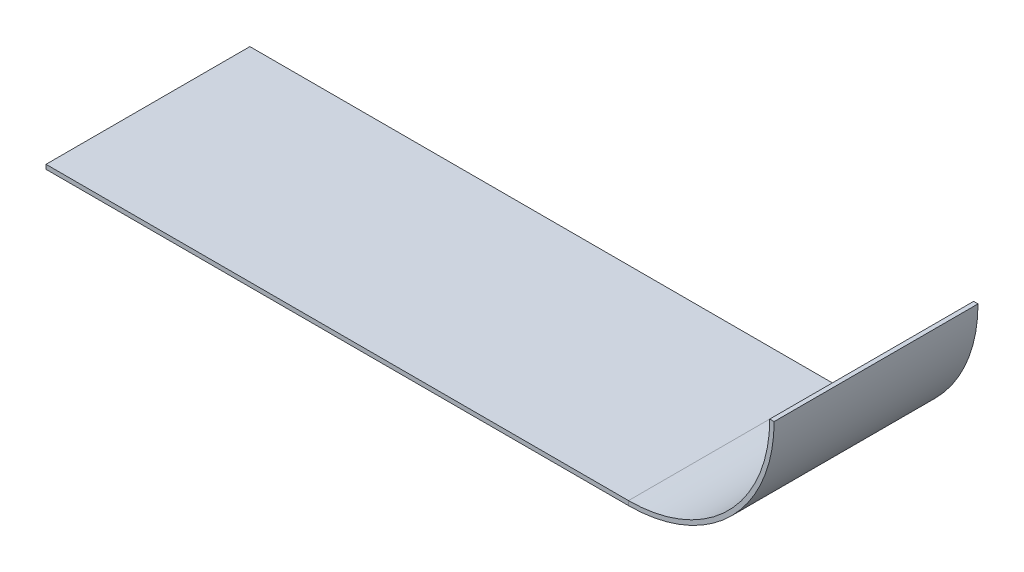
ISO-10303-21;
HEADER;
FILE_DESCRIPTION(('STEP AP214'),'2;1');
FILE_NAME('part.step','',(''),(''),'','','');
FILE_SCHEMA(('AUTOMOTIVE_DESIGN { 1 0 10303 214 1 1 1 1 }'));
ENDSEC;
DATA;
#1=APPLICATION_CONTEXT('core data for automotive mechanical design processes');
#2=APPLICATION_PROTOCOL_DEFINITION('international standard','automotive_design',2000,#1);
#3=PRODUCT_CONTEXT('',#1,'mechanical');
#4=PRODUCT('Part','Part','',(#3));
#5=PRODUCT_RELATED_PRODUCT_CATEGORY('part','',(#4));
#6=PRODUCT_DEFINITION_FORMATION('','',#4);
#7=PRODUCT_DEFINITION_CONTEXT('part definition',#1,'design');
#8=PRODUCT_DEFINITION('design','',#6,#7);
#9=PRODUCT_DEFINITION_SHAPE('','',#8);
#10=(LENGTH_UNIT() NAMED_UNIT(*) SI_UNIT(.MILLI.,.METRE.));
#11=(NAMED_UNIT(*) PLANE_ANGLE_UNIT() SI_UNIT($,.RADIAN.));
#12=(NAMED_UNIT(*) SI_UNIT($,.STERADIAN.) SOLID_ANGLE_UNIT());
#13=UNCERTAINTY_MEASURE_WITH_UNIT(LENGTH_MEASURE(1.E-05),#10,'distance_accuracy_value','');
#14=(GEOMETRIC_REPRESENTATION_CONTEXT(3) GLOBAL_UNCERTAINTY_ASSIGNED_CONTEXT((#13)) GLOBAL_UNIT_ASSIGNED_CONTEXT((#10,
#11,#12)) REPRESENTATION_CONTEXT('',''));
#15=CARTESIAN_POINT('',(0.,0.,0.));
#16=DIRECTION('',(0.,0.,1.));
#17=DIRECTION('',(1.,0.,0.));
#18=AXIS2_PLACEMENT_3D('',#15,#16,#17);
#19=CARTESIAN_POINT('',(200.,0.,70.));
#20=DIRECTION('',(0.,0.,1.));
#21=DIRECTION('',(1.,0.,0.));
#22=AXIS2_PLACEMENT_3D('',#19,#20,#21);
#23=PLANE('',#22);
#24=DIRECTION('',(0.,1.,0.));
#25=VECTOR('',#24,1.);
#26=CARTESIAN_POINT('',(200.,0.,70.));
#27=LINE('',#26,#25);
#28=CARTESIAN_POINT('',(200.,0.,70.));
#29=VERTEX_POINT('',#28);
#30=CARTESIAN_POINT('',(200.,1.50000000000002,70.));
#31=VERTEX_POINT('',#30);
#32=EDGE_CURVE('E11',#29,#31,#27,.T.);
#33=ORIENTED_EDGE('',*,*,#32,.F.);
#34=CARTESIAN_POINT('',(200.,50.,70.));
#35=DIRECTION('',(0.,0.,1.));
#36=DIRECTION('',(1.,0.,0.));
#37=AXIS2_PLACEMENT_3D('',#34,#35,#36);
#38=CIRCLE('',#37,50.);
#39=CARTESIAN_POINT('',(250.,50.,70.));
#40=VERTEX_POINT('',#39);
#41=EDGE_CURVE('E89',#29,#40,#38,.T.);
#42=ORIENTED_EDGE('',*,*,#41,.T.);
#43=DIRECTION('',(1.,0.,0.));
#44=VECTOR('',#43,1.);
#45=CARTESIAN_POINT('',(248.5,50.,70.));
#46=LINE('',#45,#44);
#47=CARTESIAN_POINT('',(248.5,50.,70.));
#48=VERTEX_POINT('',#47);
#49=EDGE_CURVE('E166',#48,#40,#46,.T.);
#50=ORIENTED_EDGE('',*,*,#49,.F.);
#51=CARTESIAN_POINT('',(200.,50.,70.));
#52=DIRECTION('',(0.,0.,1.));
#53=DIRECTION('',(1.,0.,0.));
#54=AXIS2_PLACEMENT_3D('',#51,#52,#53);
#55=CIRCLE('',#54,48.5);
#56=EDGE_CURVE('E118',#31,#48,#55,.T.);
#57=ORIENTED_EDGE('',*,*,#56,.F.);
#58=EDGE_LOOP('',(#33,#42,#50,#57));
#59=FACE_BOUND('',#58,.T.);
#60=ADVANCED_FACE('F41',(#59),#23,.T.);
#61=CARTESIAN_POINT('',(200.,1.50000000000002,0.));
#62=DIRECTION('',(0.,0.,-1.));
#63=DIRECTION('',(-1.,0.,0.));
#64=AXIS2_PLACEMENT_3D('',#61,#62,#63);
#65=PLANE('',#64);
#66=DIRECTION('',(0.,-1.,0.));
#67=VECTOR('',#66,1.);
#68=CARTESIAN_POINT('',(200.,1.50000000000002,0.));
#69=LINE('',#68,#67);
#70=CARTESIAN_POINT('',(200.,1.50000000000002,0.));
#71=VERTEX_POINT('',#70);
#72=CARTESIAN_POINT('',(200.,0.,0.));
#73=VERTEX_POINT('',#72);
#74=EDGE_CURVE('E50',#71,#73,#69,.T.);
#75=ORIENTED_EDGE('',*,*,#74,.F.);
#76=CARTESIAN_POINT('',(200.,50.,0.));
#77=DIRECTION('',(0.,0.,1.));
#78=DIRECTION('',(1.,0.,0.));
#79=AXIS2_PLACEMENT_3D('',#76,#77,#78);
#80=CIRCLE('',#79,48.5);
#81=CARTESIAN_POINT('',(248.5,50.,0.));
#82=VERTEX_POINT('',#81);
#83=EDGE_CURVE('E137',#71,#82,#80,.T.);
#84=ORIENTED_EDGE('',*,*,#83,.T.);
#85=DIRECTION('',(1.,0.,0.));
#86=VECTOR('',#85,1.);
#87=CARTESIAN_POINT('',(248.5,50.,0.));
#88=LINE('',#87,#86);
#89=CARTESIAN_POINT('',(250.,50.,0.));
#90=VERTEX_POINT('',#89);
#91=EDGE_CURVE('E133',#82,#90,#88,.T.);
#92=ORIENTED_EDGE('',*,*,#91,.T.);
#93=CARTESIAN_POINT('',(200.,50.,0.));
#94=DIRECTION('',(0.,0.,1.));
#95=DIRECTION('',(1.,0.,0.));
#96=AXIS2_PLACEMENT_3D('',#93,#94,#95);
#97=CIRCLE('',#96,50.);
#98=EDGE_CURVE('E129',#73,#90,#97,.T.);
#99=ORIENTED_EDGE('',*,*,#98,.F.);
#100=EDGE_LOOP('',(#75,#84,#92,#99));
#101=FACE_BOUND('',#100,.T.);
#102=ADVANCED_FACE('F172',(#101),#65,.T.);
#103=CARTESIAN_POINT('',(200.,50.,70.));
#104=DIRECTION('',(0.,0.,-1.));
#105=DIRECTION('',(-1.,0.,0.));
#106=AXIS2_PLACEMENT_3D('',#103,#104,#105);
#107=CYLINDRICAL_SURFACE('',#106,50.);
#108=ORIENTED_EDGE('',*,*,#98,.T.);
#109=DIRECTION('',(0.,0.,-1.));
#110=VECTOR('',#109,1.);
#111=CARTESIAN_POINT('',(250.,50.,70.));
#112=LINE('',#111,#110);
#113=EDGE_CURVE('E159',#40,#90,#112,.T.);
#114=ORIENTED_EDGE('',*,*,#113,.F.);
#115=ORIENTED_EDGE('',*,*,#41,.F.);
#116=DIRECTION('',(0.,0.,-1.));
#117=VECTOR('',#116,1.);
#118=CARTESIAN_POINT('',(200.,0.,70.));
#119=LINE('',#118,#117);
#120=EDGE_CURVE('E125',#29,#73,#119,.T.);
#121=ORIENTED_EDGE('',*,*,#120,.T.);
#122=EDGE_LOOP('',(#108,#114,#115,#121));
#123=FACE_BOUND('',#122,.T.);
#124=ADVANCED_FACE('F169',(#123),#107,.T.);
#125=CARTESIAN_POINT('',(248.5,50.,70.));
#126=DIRECTION('',(0.,1.,0.));
#127=DIRECTION('',(0.,0.,1.));
#128=AXIS2_PLACEMENT_3D('',#125,#126,#127);
#129=PLANE('',#128);
#130=ORIENTED_EDGE('',*,*,#91,.F.);
#131=DIRECTION('',(0.,0.,-1.));
#132=VECTOR('',#131,1.);
#133=CARTESIAN_POINT('',(248.5,50.,70.));
#134=LINE('',#133,#132);
#135=EDGE_CURVE('E156',#48,#82,#134,.T.);
#136=ORIENTED_EDGE('',*,*,#135,.F.);
#137=ORIENTED_EDGE('',*,*,#49,.T.);
#138=ORIENTED_EDGE('',*,*,#113,.T.);
#139=EDGE_LOOP('',(#130,#136,#137,#138));
#140=FACE_BOUND('',#139,.T.);
#141=ADVANCED_FACE('F165',(#140),#129,.T.);
#142=CARTESIAN_POINT('',(200.,50.,70.));
#143=DIRECTION('',(0.,0.,-1.));
#144=DIRECTION('',(-1.,0.,0.));
#145=AXIS2_PLACEMENT_3D('',#142,#143,#144);
#146=CYLINDRICAL_SURFACE('',#145,48.5);
#147=ORIENTED_EDGE('',*,*,#83,.F.);
#148=DIRECTION('',(0.,0.,-1.));
#149=VECTOR('',#148,1.);
#150=CARTESIAN_POINT('',(200.,1.50000000000002,70.));
#151=LINE('',#150,#149);
#152=EDGE_CURVE('E110',#31,#71,#151,.T.);
#153=ORIENTED_EDGE('',*,*,#152,.F.);
#154=ORIENTED_EDGE('',*,*,#56,.T.);
#155=ORIENTED_EDGE('',*,*,#135,.T.);
#156=EDGE_LOOP('',(#147,#153,#154,#155));
#157=FACE_BOUND('',#156,.T.);
#158=ADVANCED_FACE('F175',(#157),#146,.F.);
#159=CARTESIAN_POINT('',(0.,1.5,70.));
#160=DIRECTION('',(0.,1.,0.));
#161=DIRECTION('',(0.,0.,1.));
#162=AXIS2_PLACEMENT_3D('',#159,#160,#161);
#163=PLANE('',#162);
#164=DIRECTION('',(1.,0.,0.));
#165=VECTOR('',#164,1.);
#166=CARTESIAN_POINT('',(0.,1.5,0.));
#167=LINE('',#166,#165);
#168=CARTESIAN_POINT('',(0.,1.5,0.));
#169=VERTEX_POINT('',#168);
#170=EDGE_CURVE('E104',#169,#71,#167,.T.);
#171=ORIENTED_EDGE('',*,*,#170,.F.);
#172=DIRECTION('',(0.,0.,-1.));
#173=VECTOR('',#172,1.);
#174=CARTESIAN_POINT('',(0.,1.5,70.));
#175=LINE('',#174,#173);
#176=CARTESIAN_POINT('',(0.,1.5,70.));
#177=VERTEX_POINT('',#176);
#178=EDGE_CURVE('E99',#177,#169,#175,.T.);
#179=ORIENTED_EDGE('',*,*,#178,.F.);
#180=DIRECTION('',(1.,0.,0.));
#181=VECTOR('',#180,1.);
#182=CARTESIAN_POINT('',(0.,1.5,70.));
#183=LINE('',#182,#181);
#184=EDGE_CURVE('E103',#177,#31,#183,.T.);
#185=ORIENTED_EDGE('',*,*,#184,.T.);
#186=ORIENTED_EDGE('',*,*,#152,.T.);
#187=EDGE_LOOP('',(#171,#179,#185,#186));
#188=FACE_BOUND('',#187,.T.);
#189=ADVANCED_FACE('F101',(#188),#163,.T.);
#190=CARTESIAN_POINT('',(0.,0.,70.));
#191=DIRECTION('',(-1.,0.,0.));
#192=DIRECTION('',(0.,0.,1.));
#193=AXIS2_PLACEMENT_3D('',#190,#191,#192);
#194=PLANE('',#193);
#195=DIRECTION('',(0.,1.,0.));
#196=VECTOR('',#195,1.);
#197=CARTESIAN_POINT('',(0.,0.,0.));
#198=LINE('',#197,#196);
#199=CARTESIAN_POINT('',(0.,0.,0.));
#200=VERTEX_POINT('',#199);
#201=EDGE_CURVE('E143',#200,#169,#198,.T.);
#202=ORIENTED_EDGE('',*,*,#201,.F.);
#203=DIRECTION('',(0.,0.,-1.));
#204=VECTOR('',#203,1.);
#205=CARTESIAN_POINT('',(0.,0.,70.));
#206=LINE('',#205,#204);
#207=CARTESIAN_POINT('',(0.,0.,70.));
#208=VERTEX_POINT('',#207);
#209=EDGE_CURVE('E79',#208,#200,#206,.T.);
#210=ORIENTED_EDGE('',*,*,#209,.F.);
#211=DIRECTION('',(0.,1.,0.));
#212=VECTOR('',#211,1.);
#213=CARTESIAN_POINT('',(0.,0.,70.));
#214=LINE('',#213,#212);
#215=EDGE_CURVE('E115',#208,#177,#214,.T.);
#216=ORIENTED_EDGE('',*,*,#215,.T.);
#217=ORIENTED_EDGE('',*,*,#178,.T.);
#218=EDGE_LOOP('',(#202,#210,#216,#217));
#219=FACE_BOUND('',#218,.T.);
#220=ADVANCED_FACE('F120',(#219),#194,.T.);
#221=CARTESIAN_POINT('',(0.,0.,70.));
#222=DIRECTION('',(0.,1.,0.));
#223=DIRECTION('',(0.,0.,1.));
#224=AXIS2_PLACEMENT_3D('',#221,#222,#223);
#225=PLANE('',#224);
#226=DIRECTION('',(1.,0.,0.));
#227=VECTOR('',#226,1.);
#228=CARTESIAN_POINT('',(0.,0.,0.));
#229=LINE('',#228,#227);
#230=EDGE_CURVE('E146',#200,#73,#229,.T.);
#231=ORIENTED_EDGE('',*,*,#230,.T.);
#232=ORIENTED_EDGE('',*,*,#120,.F.);
#233=DIRECTION('',(1.,0.,0.));
#234=VECTOR('',#233,1.);
#235=CARTESIAN_POINT('',(0.,0.,70.));
#236=LINE('',#235,#234);
#237=EDGE_CURVE('E122',#208,#29,#236,.T.);
#238=ORIENTED_EDGE('',*,*,#237,.F.);
#239=ORIENTED_EDGE('',*,*,#209,.T.);
#240=EDGE_LOOP('',(#231,#232,#238,#239));
#241=FACE_BOUND('',#240,.T.);
#242=ADVANCED_FACE('F178',(#241),#225,.F.);
#243=CARTESIAN_POINT('',(200.,50.,70.));
#244=DIRECTION('',(0.,0.,1.));
#245=DIRECTION('',(1.,0.,0.));
#246=AXIS2_PLACEMENT_3D('',#243,#244,#245);
#247=PLANE('',#246);
#248=ORIENTED_EDGE('',*,*,#237,.T.);
#249=ORIENTED_EDGE('',*,*,#32,.T.);
#250=ORIENTED_EDGE('',*,*,#184,.F.);
#251=ORIENTED_EDGE('',*,*,#215,.F.);
#252=EDGE_LOOP('',(#248,#249,#250,#251));
#253=FACE_BOUND('',#252,.T.);
#254=ADVANCED_FACE('F114',(#253),#247,.T.);
#255=CARTESIAN_POINT('',(200.,50.,0.));
#256=DIRECTION('',(0.,0.,1.));
#257=DIRECTION('',(1.,0.,0.));
#258=AXIS2_PLACEMENT_3D('',#255,#256,#257);
#259=PLANE('',#258);
#260=ORIENTED_EDGE('',*,*,#170,.T.);
#261=ORIENTED_EDGE('',*,*,#74,.T.);
#262=ORIENTED_EDGE('',*,*,#230,.F.);
#263=ORIENTED_EDGE('',*,*,#201,.T.);
#264=EDGE_LOOP('',(#260,#261,#262,#263));
#265=FACE_BOUND('',#264,.T.);
#266=ADVANCED_FACE('F177',(#265),#259,.F.);
#267=CLOSED_SHELL('',(#60,#102,#124,#141,#158,#189,#220,#242,#254,#266));
#268=MANIFOLD_SOLID_BREP('B2',#267);
#269=ADVANCED_BREP_SHAPE_REPRESENTATION('',(#18,#268),#14);
#270=SHAPE_DEFINITION_REPRESENTATION(#9,#269);
ENDSEC;
END-ISO-10303-21;
